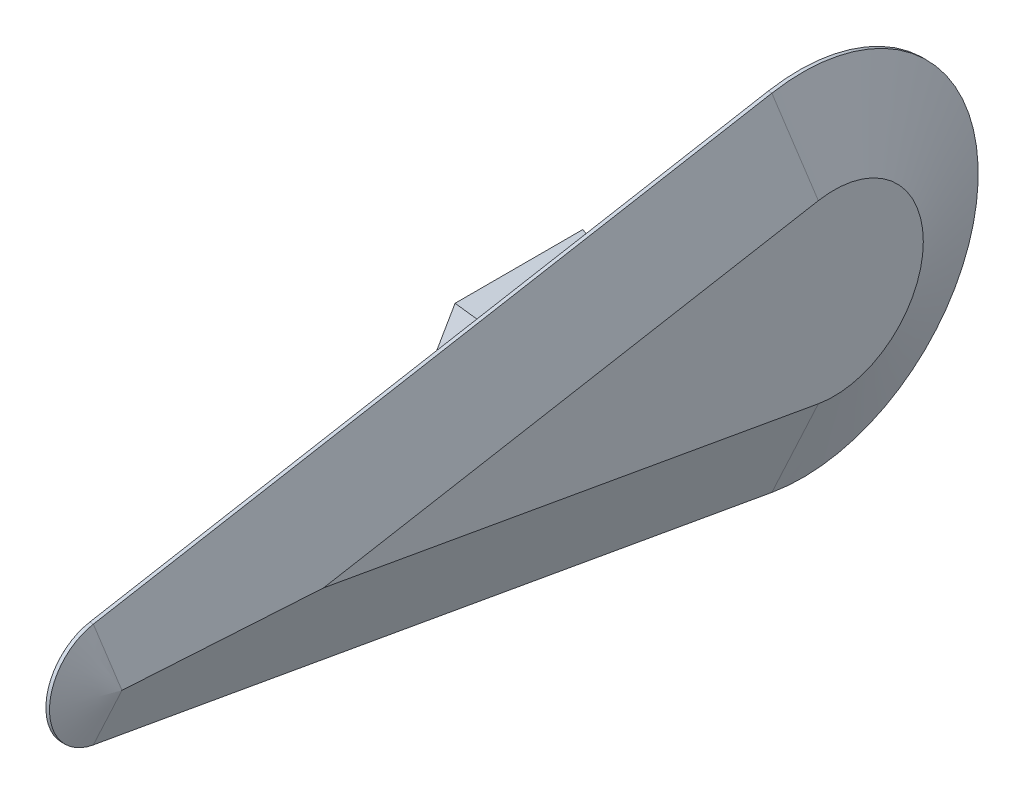
ISO-10303-21;
HEADER;
FILE_DESCRIPTION(('STEP AP214'),'2;1');
FILE_NAME('part.step','',(''),(''),'','','');
FILE_SCHEMA(('AUTOMOTIVE_DESIGN { 1 0 10303 214 1 1 1 1 }'));
ENDSEC;
DATA;
#1=APPLICATION_CONTEXT('core data for automotive mechanical design processes');
#2=APPLICATION_PROTOCOL_DEFINITION('international standard','automotive_design',2000,#1);
#3=PRODUCT_CONTEXT('',#1,'mechanical');
#4=PRODUCT('Part','Part','',(#3));
#5=PRODUCT_RELATED_PRODUCT_CATEGORY('part','',(#4));
#6=PRODUCT_DEFINITION_FORMATION('','',#4);
#7=PRODUCT_DEFINITION_CONTEXT('part definition',#1,'design');
#8=PRODUCT_DEFINITION('design','',#6,#7);
#9=PRODUCT_DEFINITION_SHAPE('','',#8);
#10=(LENGTH_UNIT() NAMED_UNIT(*) SI_UNIT(.MILLI.,.METRE.));
#11=(NAMED_UNIT(*) PLANE_ANGLE_UNIT() SI_UNIT($,.RADIAN.));
#12=(NAMED_UNIT(*) SI_UNIT($,.STERADIAN.) SOLID_ANGLE_UNIT());
#13=UNCERTAINTY_MEASURE_WITH_UNIT(LENGTH_MEASURE(1.E-05),#10,'distance_accuracy_value','');
#14=(GEOMETRIC_REPRESENTATION_CONTEXT(3) GLOBAL_UNCERTAINTY_ASSIGNED_CONTEXT((#13)) GLOBAL_UNIT_ASSIGNED_CONTEXT((#10,
#11,#12)) REPRESENTATION_CONTEXT('',''));
#15=CARTESIAN_POINT('',(0.,0.,0.));
#16=DIRECTION('',(0.,0.,1.));
#17=DIRECTION('',(1.,0.,0.));
#18=AXIS2_PLACEMENT_3D('',#15,#16,#17);
#19=CARTESIAN_POINT('',(0.,0.,0.));
#20=DIRECTION('',(1.,0.,0.));
#21=DIRECTION('',(0.,0.,-1.));
#22=AXIS2_PLACEMENT_3D('',#19,#20,#21);
#23=PLANE('',#22);
#24=CARTESIAN_POINT('',(0.,0.,0.));
#25=DIRECTION('',(1.,0.,0.));
#26=DIRECTION('',(0.,0.,-1.));
#27=AXIS2_PLACEMENT_3D('',#24,#25,#26);
#28=CIRCLE('',#27,15.1809221376421);
#29=CARTESIAN_POINT('',(0.,-14.9466567262577,2.65666137408736));
#30=VERTEX_POINT('',#29);
#31=CARTESIAN_POINT('',(0.,14.9466567262577,2.65666137408737));
#32=VERTEX_POINT('',#31);
#33=EDGE_CURVE('E346',#30,#32,#28,.F.);
#34=ORIENTED_EDGE('',*,*,#33,.T.);
#35=DIRECTION('',(0.,0.175,-0.984568433375761));
#36=VECTOR('',#35,1.);
#37=CARTESIAN_POINT('',(0.,14.9466567262576,2.65666137408736));
#38=LINE('',#37,#36);
#39=CARTESIAN_POINT('',(0.,49.4065518944094,-191.218338625913));
#40=VERTEX_POINT('',#39);
#41=EDGE_CURVE('E352',#32,#40,#38,.T.);
#42=ORIENTED_EDGE('',*,*,#41,.T.);
#43=CARTESIAN_POINT('',(0.,0.,-200.));
#44=DIRECTION('',(1.,0.,0.));
#45=DIRECTION('',(0.,0.,-1.));
#46=AXIS2_PLACEMENT_3D('',#43,#44,#45);
#47=CIRCLE('',#46,50.1809221376421);
#48=CARTESIAN_POINT('',(0.,-49.4065518944093,-191.218338625913));
#49=VERTEX_POINT('',#48);
#50=EDGE_CURVE('E349',#40,#49,#47,.F.);
#51=ORIENTED_EDGE('',*,*,#50,.T.);
#52=DIRECTION('',(0.,0.175,0.984568433375761));
#53=VECTOR('',#52,1.);
#54=CARTESIAN_POINT('',(0.,-14.9466567262577,2.65666137408736));
#55=LINE('',#54,#53);
#56=EDGE_CURVE('E343',#49,#30,#55,.T.);
#57=ORIENTED_EDGE('',*,*,#56,.T.);
#58=EDGE_LOOP('',(#34,#42,#51,#57));
#59=FACE_BOUND('',#58,.T.);
#60=DIRECTION('',(0.,0.866025403784439,-0.5));
#61=VECTOR('',#60,1.);
#62=CARTESIAN_POINT('',(0.,0.,-97.6683849253809));
#63=LINE('',#62,#61);
#64=CARTESIAN_POINT('',(0.,0.,-97.6683849253809));
#65=VERTEX_POINT('',#64);
#66=CARTESIAN_POINT('',(0.,28.,-113.83419246269));
#67=VERTEX_POINT('',#66);
#68=EDGE_CURVE('E196',#65,#67,#63,.T.);
#69=ORIENTED_EDGE('',*,*,#68,.F.);
#70=DIRECTION('',(0.,0.866025403784439,0.5));
#71=VECTOR('',#70,1.);
#72=CARTESIAN_POINT('',(0.,-28.,-113.83419246269));
#73=LINE('',#72,#71);
#74=CARTESIAN_POINT('',(0.,-28.,-113.83419246269));
#75=VERTEX_POINT('',#74);
#76=EDGE_CURVE('E231',#75,#65,#73,.T.);
#77=ORIENTED_EDGE('',*,*,#76,.F.);
#78=DIRECTION('',(0.,0.,1.));
#79=VECTOR('',#78,1.);
#80=CARTESIAN_POINT('',(0.,-28.,-146.16580753731));
#81=LINE('',#80,#79);
#82=CARTESIAN_POINT('',(0.,-28.,-146.16580753731));
#83=VERTEX_POINT('',#82);
#84=EDGE_CURVE('E227',#83,#75,#81,.T.);
#85=ORIENTED_EDGE('',*,*,#84,.F.);
#86=DIRECTION('',(0.,-0.866025403784438,0.500000000000001));
#87=VECTOR('',#86,1.);
#88=CARTESIAN_POINT('',(0.,0.,-162.331615074619));
#89=LINE('',#88,#87);
#90=CARTESIAN_POINT('',(0.,0.,-162.331615074619));
#91=VERTEX_POINT('',#90);
#92=EDGE_CURVE('E223',#91,#83,#89,.T.);
#93=ORIENTED_EDGE('',*,*,#92,.F.);
#94=DIRECTION('',(0.,-0.866025403784438,-0.5));
#95=VECTOR('',#94,1.);
#96=CARTESIAN_POINT('',(0.,28.,-146.16580753731));
#97=LINE('',#96,#95);
#98=CARTESIAN_POINT('',(0.,28.,-146.16580753731));
#99=VERTEX_POINT('',#98);
#100=EDGE_CURVE('E71',#99,#91,#97,.T.);
#101=ORIENTED_EDGE('',*,*,#100,.F.);
#102=DIRECTION('',(0.,0.,-1.));
#103=VECTOR('',#102,1.);
#104=CARTESIAN_POINT('',(0.,28.,-113.83419246269));
#105=LINE('',#104,#103);
#106=EDGE_CURVE('E66',#67,#99,#105,.T.);
#107=ORIENTED_EDGE('',*,*,#106,.F.);
#108=EDGE_LOOP('',(#69,#77,#85,#93,#101,#107));
#109=FACE_BOUND('',#108,.T.);
#110=ADVANCED_FACE('F47',(#59,#109),#23,.F.);
#111=CARTESIAN_POINT('',(0.,17.7222318007637,3.15));
#112=DIRECTION('',(0.939692620785909,0.336742236697104,0.0598535250819916));
#113=DIRECTION('',(-0.337347042376119,0.941380355116934,0.));
#114=AXIS2_PLACEMENT_3D('',#111,#112,#113);
#115=PLANE('',#114);
#116=DIRECTION('',(-0.342020143325666,0.925191691501946,0.164446208637534));
#117=VECTOR('',#116,1.);
#118=CARTESIAN_POINT('',(0.,52.1821269689153,-190.725));
#119=LINE('',#118,#117);
#120=CARTESIAN_POINT('',(10.,25.1313315828379,-195.533085484046));
#121=VERTEX_POINT('',#120);
#122=CARTESIAN_POINT('',(1.02606042997705,49.4065518944093,-191.218338625913));
#123=VERTEX_POINT('',#122);
#124=EDGE_CURVE('E319',#121,#123,#119,.T.);
#125=ORIENTED_EDGE('',*,*,#124,.T.);
#126=DIRECTION('',(0.,0.175,-0.984568433375761));
#127=VECTOR('',#126,1.);
#128=CARTESIAN_POINT('',(1.02606042997705,14.9466567262577,2.65666137408737));
#129=LINE('',#128,#127);
#130=CARTESIAN_POINT('',(1.02606042997705,14.9466567262577,2.65666137408737));
#131=VERTEX_POINT('',#130);
#132=EDGE_CURVE('E314',#123,#131,#129,.F.);
#133=ORIENTED_EDGE('',*,*,#132,.T.);
#134=DIRECTION('',(-0.342020143325666,0.925191691501946,0.164446208637534));
#135=VECTOR('',#134,1.);
#136=CARTESIAN_POINT('',(0.,17.7222318007637,3.15));
#137=LINE('',#136,#135);
#138=CARTESIAN_POINT('',(6.55146421679159,0.,0.));
#139=VERTEX_POINT('',#138);
#140=EDGE_CURVE('E310',#139,#131,#137,.T.);
#141=ORIENTED_EDGE('',*,*,#140,.F.);
#142=DIRECTION('',(0.0635659770910905,0.,-0.997977638304814));
#143=VECTOR('',#142,1.);
#144=CARTESIAN_POINT('',(6.32516426673723,0.,3.55288001598889));
#145=LINE('',#144,#143);
#146=CARTESIAN_POINT('',(10.,0.,-54.1415668259798));
#147=VERTEX_POINT('',#146);
#148=EDGE_CURVE('E315',#147,#139,#145,.F.);
#149=ORIENTED_EDGE('',*,*,#148,.F.);
#150=DIRECTION('',(0.,0.175,-0.984568433375761));
#151=VECTOR('',#150,1.);
#152=CARTESIAN_POINT('',(10.,-9.32856358531371,-1.65808548404563));
#153=LINE('',#152,#151);
#154=EDGE_CURVE('E331',#121,#147,#153,.F.);
#155=ORIENTED_EDGE('',*,*,#154,.F.);
#156=EDGE_LOOP('',(#125,#133,#141,#149,#155));
#157=FACE_BOUND('',#156,.T.);
#158=ADVANCED_FACE('F394',(#157),#115,.T.);
#159=CARTESIAN_POINT('',(0.,0.,0.));
#160=DIRECTION('',(-1.,0.,0.));
#161=DIRECTION('',(0.,0.,-1.));
#162=AXIS2_PLACEMENT_3D('',#159,#160,#161);
#163=CONICAL_SURFACE('',#162,18.,1.22173047639603);
#164=ORIENTED_EDGE('',*,*,#140,.T.);
#165=CARTESIAN_POINT('',(1.02606042997705,0.,0.));
#166=DIRECTION('',(1.,0.,0.));
#167=DIRECTION('',(0.,0.,-1.));
#168=AXIS2_PLACEMENT_3D('',#165,#166,#167);
#169=CIRCLE('',#168,15.1809221376421);
#170=CARTESIAN_POINT('',(1.02606042997705,-14.9466567262577,2.65666137408737));
#171=VERTEX_POINT('',#170);
#172=EDGE_CURVE('E58',#131,#171,#169,.T.);
#173=ORIENTED_EDGE('',*,*,#172,.T.);
#174=DIRECTION('',(-0.342020143325666,-0.925191691501946,0.164446208637534));
#175=VECTOR('',#174,1.);
#176=CARTESIAN_POINT('',(0.,-17.7222318007637,3.15));
#177=LINE('',#176,#175);
#178=EDGE_CURVE('E318',#139,#171,#177,.T.);
#179=ORIENTED_EDGE('',*,*,#178,.F.);
#180=EDGE_LOOP('',(#164,#173,#179));
#181=FACE_BOUND('',#180,.T.);
#182=ADVANCED_FACE('F398',(#181),#163,.T.);
#183=CARTESIAN_POINT('',(0.,-17.7222318007637,3.15));
#184=DIRECTION('',(0.939692620785909,-0.336742236697104,0.0598535250819916));
#185=DIRECTION('',(0.337347042376119,0.941380355116934,0.));
#186=AXIS2_PLACEMENT_3D('',#183,#184,#185);
#187=PLANE('',#186);
#188=ORIENTED_EDGE('',*,*,#178,.T.);
#189=DIRECTION('',(0.,-0.175,-0.984568433375761));
#190=VECTOR('',#189,1.);
#191=CARTESIAN_POINT('',(1.02606042997705,-49.4065518944094,-191.218338625913));
#192=LINE('',#191,#190);
#193=CARTESIAN_POINT('',(1.02606042997705,-49.4065518944094,-191.218338625913));
#194=VERTEX_POINT('',#193);
#195=EDGE_CURVE('E11',#171,#194,#192,.T.);
#196=ORIENTED_EDGE('',*,*,#195,.T.);
#197=DIRECTION('',(-0.342020143325666,-0.925191691501946,0.164446208637534));
#198=VECTOR('',#197,1.);
#199=CARTESIAN_POINT('',(0.,-52.1821269689153,-190.725));
#200=LINE('',#199,#198);
#201=CARTESIAN_POINT('',(10.,-25.1313315828379,-195.533085484046));
#202=VERTEX_POINT('',#201);
#203=EDGE_CURVE('E323',#202,#194,#200,.T.);
#204=ORIENTED_EDGE('',*,*,#203,.F.);
#205=DIRECTION('',(0.,0.175,0.984568433375761));
#206=VECTOR('',#205,1.);
#207=CARTESIAN_POINT('',(10.,9.32856358531369,-1.65808548404563));
#208=LINE('',#207,#206);
#209=EDGE_CURVE('E335',#202,#147,#208,.T.);
#210=ORIENTED_EDGE('',*,*,#209,.T.);
#211=ORIENTED_EDGE('',*,*,#148,.T.);
#212=EDGE_LOOP('',(#188,#196,#204,#210,#211));
#213=FACE_BOUND('',#212,.T.);
#214=ADVANCED_FACE('F400',(#213),#187,.T.);
#215=CARTESIAN_POINT('',(0.,0.,-200.));
#216=DIRECTION('',(-1.,0.,0.));
#217=DIRECTION('',(0.,0.,-1.));
#218=AXIS2_PLACEMENT_3D('',#215,#216,#217);
#219=CONICAL_SURFACE('',#218,53.,1.22173047639603);
#220=ORIENTED_EDGE('',*,*,#203,.T.);
#221=CARTESIAN_POINT('',(1.02606042997705,0.,-200.));
#222=DIRECTION('',(1.,0.,0.));
#223=DIRECTION('',(0.,0.,-1.));
#224=AXIS2_PLACEMENT_3D('',#221,#222,#223);
#225=CIRCLE('',#224,50.1809221376421);
#226=EDGE_CURVE('E356',#194,#123,#225,.T.);
#227=ORIENTED_EDGE('',*,*,#226,.T.);
#228=ORIENTED_EDGE('',*,*,#124,.F.);
#229=CARTESIAN_POINT('',(10.,0.,-200.));
#230=DIRECTION('',(1.,0.,0.));
#231=DIRECTION('',(0.,0.,-1.));
#232=AXIS2_PLACEMENT_3D('',#229,#230,#231);
#233=CIRCLE('',#232,25.5252258054535);
#234=EDGE_CURVE('E324',#202,#121,#233,.T.);
#235=ORIENTED_EDGE('',*,*,#234,.F.);
#236=EDGE_LOOP('',(#220,#227,#228,#235));
#237=FACE_BOUND('',#236,.T.);
#238=ADVANCED_FACE('F406',(#237),#219,.T.);
#239=CARTESIAN_POINT('',(10.,0.,0.));
#240=DIRECTION('',(1.,0.,0.));
#241=DIRECTION('',(0.,0.,-1.));
#242=AXIS2_PLACEMENT_3D('',#239,#240,#241);
#243=PLANE('',#242);
#244=ORIENTED_EDGE('',*,*,#154,.T.);
#245=ORIENTED_EDGE('',*,*,#209,.F.);
#246=ORIENTED_EDGE('',*,*,#234,.T.);
#247=EDGE_LOOP('',(#244,#245,#246));
#248=FACE_BOUND('',#247,.T.);
#249=ADVANCED_FACE('F403',(#248),#243,.T.);
#250=CARTESIAN_POINT('',(0.,-14.9466567262577,2.65666137408736));
#251=DIRECTION('',(0.,-0.984568433375761,0.175));
#252=DIRECTION('',(0.,-0.175,-0.984568433375761));
#253=AXIS2_PLACEMENT_3D('',#250,#251,#252);
#254=PLANE('',#253);
#255=DIRECTION('',(1.,0.,0.));
#256=VECTOR('',#255,1.);
#257=CARTESIAN_POINT('',(0.,-14.9466567262577,2.65666137408736));
#258=LINE('',#257,#256);
#259=EDGE_CURVE('E365',#30,#171,#258,.T.);
#260=ORIENTED_EDGE('',*,*,#259,.F.);
#261=ORIENTED_EDGE('',*,*,#56,.F.);
#262=DIRECTION('',(-1.,0.,0.));
#263=VECTOR('',#262,1.);
#264=CARTESIAN_POINT('',(1.02606042997705,-49.4065518944094,-191.218338625913));
#265=LINE('',#264,#263);
#266=EDGE_CURVE('E52',#194,#49,#265,.T.);
#267=ORIENTED_EDGE('',*,*,#266,.F.);
#268=ORIENTED_EDGE('',*,*,#195,.F.);
#269=EDGE_LOOP('',(#260,#261,#267,#268));
#270=FACE_BOUND('',#269,.T.);
#271=ADVANCED_FACE('F50',(#270),#254,.T.);
#272=CARTESIAN_POINT('',(1.02606042997705,0.,-200.));
#273=DIRECTION('',(1.,0.,0.));
#274=DIRECTION('',(0.,0.,-1.));
#275=AXIS2_PLACEMENT_3D('',#272,#273,#274);
#276=CYLINDRICAL_SURFACE('',#275,50.1809221376421);
#277=ORIENTED_EDGE('',*,*,#266,.T.);
#278=ORIENTED_EDGE('',*,*,#50,.F.);
#279=DIRECTION('',(-1.,0.,0.));
#280=VECTOR('',#279,1.);
#281=CARTESIAN_POINT('',(1.02606042997704,49.4065518944094,-191.218338625913));
#282=LINE('',#281,#280);
#283=EDGE_CURVE('E363',#123,#40,#282,.T.);
#284=ORIENTED_EDGE('',*,*,#283,.F.);
#285=ORIENTED_EDGE('',*,*,#226,.F.);
#286=EDGE_LOOP('',(#277,#278,#284,#285));
#287=FACE_BOUND('',#286,.T.);
#288=ADVANCED_FACE('F378',(#287),#276,.T.);
#289=CARTESIAN_POINT('',(1.02606042997705,0.,0.));
#290=DIRECTION('',(1.,0.,0.));
#291=DIRECTION('',(0.,0.,-1.));
#292=AXIS2_PLACEMENT_3D('',#289,#290,#291);
#293=CYLINDRICAL_SURFACE('',#292,15.1809221376421);
#294=ORIENTED_EDGE('',*,*,#259,.T.);
#295=ORIENTED_EDGE('',*,*,#172,.F.);
#296=DIRECTION('',(1.,0.,0.));
#297=VECTOR('',#296,1.);
#298=CARTESIAN_POINT('',(0.,14.9466567262577,2.65666137408737));
#299=LINE('',#298,#297);
#300=EDGE_CURVE('E239',#32,#131,#299,.T.);
#301=ORIENTED_EDGE('',*,*,#300,.F.);
#302=ORIENTED_EDGE('',*,*,#33,.F.);
#303=EDGE_LOOP('',(#294,#295,#301,#302));
#304=FACE_BOUND('',#303,.T.);
#305=ADVANCED_FACE('F389',(#304),#293,.T.);
#306=CARTESIAN_POINT('',(1.02606042997705,14.9466567262577,2.65666137408737));
#307=DIRECTION('',(0.,0.984568433375761,0.175));
#308=DIRECTION('',(0.,0.175,-0.984568433375761));
#309=AXIS2_PLACEMENT_3D('',#306,#307,#308);
#310=PLANE('',#309);
#311=ORIENTED_EDGE('',*,*,#283,.T.);
#312=ORIENTED_EDGE('',*,*,#41,.F.);
#313=ORIENTED_EDGE('',*,*,#300,.T.);
#314=ORIENTED_EDGE('',*,*,#132,.F.);
#315=EDGE_LOOP('',(#311,#312,#313,#314));
#316=FACE_BOUND('',#315,.T.);
#317=ADVANCED_FACE('F387',(#316),#310,.T.);
#318=CARTESIAN_POINT('',(-10.,0.,0.));
#319=DIRECTION('',(-1.,0.,0.));
#320=DIRECTION('',(0.,0.,1.));
#321=AXIS2_PLACEMENT_3D('',#318,#319,#320);
#322=PLANE('',#321);
#323=DIRECTION('',(0.,-0.866025403784439,0.5));
#324=VECTOR('',#323,1.);
#325=CARTESIAN_POINT('',(-10.,1.81985117133099,-94.5163102344219));
#326=LINE('',#325,#324);
#327=CARTESIAN_POINT('',(-10.,0.,-93.4656186707689));
#328=VERTEX_POINT('',#327);
#329=CARTESIAN_POINT('',(-10.,31.639702342662,-111.732809335384));
#330=VERTEX_POINT('',#329);
#331=EDGE_CURVE('E235',#328,#330,#326,.F.);
#332=ORIENTED_EDGE('',*,*,#331,.T.);
#333=DIRECTION('',(0.,0.,1.));
#334=VECTOR('',#333,1.);
#335=CARTESIAN_POINT('',(-10.,31.639702342662,-113.83419246269));
#336=LINE('',#335,#334);
#337=CARTESIAN_POINT('',(-10.,31.639702342662,-148.267190664616));
#338=VERTEX_POINT('',#337);
#339=EDGE_CURVE('E264',#330,#338,#336,.F.);
#340=ORIENTED_EDGE('',*,*,#339,.T.);
#341=DIRECTION('',(0.,0.866025403784438,0.5));
#342=VECTOR('',#341,1.);
#343=CARTESIAN_POINT('',(-10.,29.819851171331,-149.317882228269));
#344=LINE('',#343,#342);
#345=CARTESIAN_POINT('',(-10.,0.,-166.534381329231));
#346=VERTEX_POINT('',#345);
#347=EDGE_CURVE('E267',#338,#346,#344,.F.);
#348=ORIENTED_EDGE('',*,*,#347,.T.);
#349=DIRECTION('',(0.,0.866025403784438,-0.500000000000001));
#350=VECTOR('',#349,1.);
#351=CARTESIAN_POINT('',(-10.,-1.819851171331,-165.483689765578));
#352=LINE('',#351,#350);
#353=CARTESIAN_POINT('',(-10.,-31.639702342662,-148.267190664616));
#354=VERTEX_POINT('',#353);
#355=EDGE_CURVE('E270',#346,#354,#352,.F.);
#356=ORIENTED_EDGE('',*,*,#355,.T.);
#357=DIRECTION('',(0.,0.,-1.));
#358=VECTOR('',#357,1.);
#359=CARTESIAN_POINT('',(-10.,-31.639702342662,-146.16580753731));
#360=LINE('',#359,#358);
#361=CARTESIAN_POINT('',(-10.,-31.639702342662,-111.732809335384));
#362=VERTEX_POINT('',#361);
#363=EDGE_CURVE('E273',#354,#362,#360,.F.);
#364=ORIENTED_EDGE('',*,*,#363,.T.);
#365=DIRECTION('',(0.,-0.866025403784439,-0.5));
#366=VECTOR('',#365,1.);
#367=CARTESIAN_POINT('',(-10.,-29.819851171331,-110.682117771731));
#368=LINE('',#367,#366);
#369=EDGE_CURVE('E246',#362,#328,#368,.F.);
#370=ORIENTED_EDGE('',*,*,#369,.T.);
#371=EDGE_LOOP('',(#332,#340,#348,#356,#364,#370));
#372=FACE_BOUND('',#371,.T.);
#373=DIRECTION('',(0.,-0.866025403784438,0.500000000000001));
#374=VECTOR('',#373,1.);
#375=CARTESIAN_POINT('',(-10.,1.81985117133104,-155.715438768522));
#376=LINE('',#375,#374);
#377=CARTESIAN_POINT('',(-10.,0.,-154.664747204869));
#378=VERTEX_POINT('',#377);
#379=CARTESIAN_POINT('',(-10.,-21.360297657338,-142.332373602435));
#380=VERTEX_POINT('',#379);
#381=EDGE_CURVE('E295',#378,#380,#376,.T.);
#382=ORIENTED_EDGE('',*,*,#381,.F.);
#383=DIRECTION('',(0.,-0.866025403784438,-0.5));
#384=VECTOR('',#383,1.);
#385=CARTESIAN_POINT('',(-10.,23.180148828669,-141.281682038782));
#386=LINE('',#385,#384);
#387=CARTESIAN_POINT('',(-10.,21.360297657338,-142.332373602435));
#388=VERTEX_POINT('',#387);
#389=EDGE_CURVE('E194',#388,#378,#386,.T.);
#390=ORIENTED_EDGE('',*,*,#389,.F.);
#391=DIRECTION('',(0.,0.,-1.));
#392=VECTOR('',#391,1.);
#393=CARTESIAN_POINT('',(-10.,21.360297657338,-115.566243270259));
#394=LINE('',#393,#392);
#395=CARTESIAN_POINT('',(-10.,21.360297657338,-117.667626397565));
#396=VERTEX_POINT('',#395);
#397=EDGE_CURVE('E281',#396,#388,#394,.T.);
#398=ORIENTED_EDGE('',*,*,#397,.F.);
#399=DIRECTION('',(0.,0.866025403784438,-0.5));
#400=VECTOR('',#399,1.);
#401=CARTESIAN_POINT('',(-10.,-1.81985117133104,-104.284561231478));
#402=LINE('',#401,#400);
#403=CARTESIAN_POINT('',(-10.,0.,-105.335252795131));
#404=VERTEX_POINT('',#403);
#405=EDGE_CURVE('E298',#404,#396,#402,.T.);
#406=ORIENTED_EDGE('',*,*,#405,.F.);
#407=DIRECTION('',(0.,0.866025403784439,0.5));
#408=VECTOR('',#407,1.);
#409=CARTESIAN_POINT('',(-10.,-23.180148828669,-118.718317961218));
#410=LINE('',#409,#408);
#411=CARTESIAN_POINT('',(-10.,-21.360297657338,-117.667626397565));
#412=VERTEX_POINT('',#411);
#413=EDGE_CURVE('E302',#412,#404,#410,.T.);
#414=ORIENTED_EDGE('',*,*,#413,.F.);
#415=DIRECTION('',(0.,0.,1.));
#416=VECTOR('',#415,1.);
#417=CARTESIAN_POINT('',(-10.,-21.360297657338,-144.433756729741));
#418=LINE('',#417,#416);
#419=EDGE_CURVE('E305',#380,#412,#418,.T.);
#420=ORIENTED_EDGE('',*,*,#419,.F.);
#421=EDGE_LOOP('',(#382,#390,#398,#406,#414,#420));
#422=FACE_BOUND('',#421,.T.);
#423=ADVANCED_FACE('F473',(#372,#422),#322,.T.);
#424=CARTESIAN_POINT('',(0.,0.,-97.6683849253809));
#425=DIRECTION('',(0.342020143325669,0.469846310392954,0.813797681349373));
#426=DIRECTION('',(0.,-0.866025403784439,0.5));
#427=AXIS2_PLACEMENT_3D('',#424,#425,#426);
#428=PLANE('',#427);
#429=ORIENTED_EDGE('',*,*,#68,.T.);
#430=DIRECTION('',(0.921891033043757,-0.335540895264848,-0.193724626205288));
#431=VECTOR('',#430,1.);
#432=CARTESIAN_POINT('',(0.,28.,-113.83419246269));
#433=LINE('',#432,#431);
#434=EDGE_CURVE('E236',#330,#67,#433,.T.);
#435=ORIENTED_EDGE('',*,*,#434,.F.);
#436=ORIENTED_EDGE('',*,*,#331,.F.);
#437=DIRECTION('',(0.921891033043757,0.,-0.387449252410576));
#438=VECTOR('',#437,1.);
#439=CARTESIAN_POINT('',(0.,0.,-97.6683849253809));
#440=LINE('',#439,#438);
#441=EDGE_CURVE('E241',#328,#65,#440,.T.);
#442=ORIENTED_EDGE('',*,*,#441,.T.);
#443=EDGE_LOOP('',(#429,#435,#436,#442));
#444=FACE_BOUND('',#443,.T.);
#445=ADVANCED_FACE('F455',(#444),#428,.T.);
#446=CARTESIAN_POINT('',(0.,28.,-113.83419246269));
#447=DIRECTION('',(0.342020143325669,0.939692620785908,0.));
#448=DIRECTION('',(-0.939692620785908,0.342020143325669,0.));
#449=AXIS2_PLACEMENT_3D('',#446,#447,#448);
#450=PLANE('',#449);
#451=ORIENTED_EDGE('',*,*,#106,.T.);
#452=DIRECTION('',(0.921891033043757,-0.335540895264848,0.193724626205288));
#453=VECTOR('',#452,1.);
#454=CARTESIAN_POINT('',(0.,28.,-146.16580753731));
#455=LINE('',#454,#453);
#456=EDGE_CURVE('E240',#338,#99,#455,.T.);
#457=ORIENTED_EDGE('',*,*,#456,.F.);
#458=ORIENTED_EDGE('',*,*,#339,.F.);
#459=ORIENTED_EDGE('',*,*,#434,.T.);
#460=EDGE_LOOP('',(#451,#457,#458,#459));
#461=FACE_BOUND('',#460,.T.);
#462=ADVANCED_FACE('F451',(#461),#450,.T.);
#463=CARTESIAN_POINT('',(0.,28.,-146.16580753731));
#464=DIRECTION('',(0.342020143325669,0.469846310392954,-0.813797681349373));
#465=DIRECTION('',(0.,0.866025403784438,0.5));
#466=AXIS2_PLACEMENT_3D('',#463,#464,#465);
#467=PLANE('',#466);
#468=ORIENTED_EDGE('',*,*,#100,.T.);
#469=DIRECTION('',(0.921891033043757,0.,0.387449252410577));
#470=VECTOR('',#469,1.);
#471=CARTESIAN_POINT('',(0.,0.,-162.331615074619));
#472=LINE('',#471,#470);
#473=EDGE_CURVE('E254',#346,#91,#472,.T.);
#474=ORIENTED_EDGE('',*,*,#473,.F.);
#475=ORIENTED_EDGE('',*,*,#347,.F.);
#476=ORIENTED_EDGE('',*,*,#456,.T.);
#477=EDGE_LOOP('',(#468,#474,#475,#476));
#478=FACE_BOUND('',#477,.T.);
#479=ADVANCED_FACE('F454',(#478),#467,.T.);
#480=CARTESIAN_POINT('',(0.,0.,-162.331615074619));
#481=DIRECTION('',(0.342020143325669,-0.469846310392955,-0.813797681349373));
#482=DIRECTION('',(0.,0.866025403784438,-0.500000000000001));
#483=AXIS2_PLACEMENT_3D('',#480,#481,#482);
#484=PLANE('',#483);
#485=ORIENTED_EDGE('',*,*,#92,.T.);
#486=DIRECTION('',(0.921891033043757,0.335540895264848,0.193724626205288));
#487=VECTOR('',#486,1.);
#488=CARTESIAN_POINT('',(0.,-28.,-146.16580753731));
#489=LINE('',#488,#487);
#490=EDGE_CURVE('E250',#354,#83,#489,.T.);
#491=ORIENTED_EDGE('',*,*,#490,.F.);
#492=ORIENTED_EDGE('',*,*,#355,.F.);
#493=ORIENTED_EDGE('',*,*,#473,.T.);
#494=EDGE_LOOP('',(#485,#491,#492,#493));
#495=FACE_BOUND('',#494,.T.);
#496=ADVANCED_FACE('F459',(#495),#484,.T.);
#497=CARTESIAN_POINT('',(0.,-28.,-146.16580753731));
#498=DIRECTION('',(0.342020143325669,-0.939692620785908,0.));
#499=DIRECTION('',(0.939692620785908,0.342020143325669,0.));
#500=AXIS2_PLACEMENT_3D('',#497,#498,#499);
#501=PLANE('',#500);
#502=ORIENTED_EDGE('',*,*,#84,.T.);
#503=DIRECTION('',(0.921891033043757,0.335540895264848,-0.193724626205288));
#504=VECTOR('',#503,1.);
#505=CARTESIAN_POINT('',(0.,-28.,-113.83419246269));
#506=LINE('',#505,#504);
#507=EDGE_CURVE('E245',#362,#75,#506,.T.);
#508=ORIENTED_EDGE('',*,*,#507,.F.);
#509=ORIENTED_EDGE('',*,*,#363,.F.);
#510=ORIENTED_EDGE('',*,*,#490,.T.);
#511=EDGE_LOOP('',(#502,#508,#509,#510));
#512=FACE_BOUND('',#511,.T.);
#513=ADVANCED_FACE('F463',(#512),#501,.T.);
#514=CARTESIAN_POINT('',(0.,-28.,-113.83419246269));
#515=DIRECTION('',(0.342020143325669,-0.469846310392954,0.813797681349373));
#516=DIRECTION('',(0.,-0.866025403784439,-0.5));
#517=AXIS2_PLACEMENT_3D('',#514,#515,#516);
#518=PLANE('',#517);
#519=ORIENTED_EDGE('',*,*,#76,.T.);
#520=ORIENTED_EDGE('',*,*,#441,.F.);
#521=ORIENTED_EDGE('',*,*,#369,.F.);
#522=ORIENTED_EDGE('',*,*,#507,.T.);
#523=EDGE_LOOP('',(#519,#520,#521,#522));
#524=FACE_BOUND('',#523,.T.);
#525=ADVANCED_FACE('F450',(#524),#518,.T.);
#526=CARTESIAN_POINT('',(0.,25.,-144.433756729741));
#527=DIRECTION('',(0.342020143325669,-0.469846310392954,0.813797681349373));
#528=DIRECTION('',(0.,-0.866025403784438,-0.5));
#529=AXIS2_PLACEMENT_3D('',#526,#527,#528);
#530=PLANE('',#529);
#531=DIRECTION('',(0.,-0.866025403784438,-0.5));
#532=VECTOR('',#531,1.);
#533=CARTESIAN_POINT('',(0.,25.,-144.433756729741));
#534=LINE('',#533,#532);
#535=CARTESIAN_POINT('',(0.,25.,-144.433756729741));
#536=VERTEX_POINT('',#535);
#537=CARTESIAN_POINT('',(0.,0.,-158.867513459481));
#538=VERTEX_POINT('',#537);
#539=EDGE_CURVE('E186',#536,#538,#534,.T.);
#540=ORIENTED_EDGE('',*,*,#539,.F.);
#541=DIRECTION('',(0.921891033043757,0.335540895264848,-0.193724626205288));
#542=VECTOR('',#541,1.);
#543=CARTESIAN_POINT('',(0.,25.,-144.433756729741));
#544=LINE('',#543,#542);
#545=EDGE_CURVE('E278',#388,#536,#544,.T.);
#546=ORIENTED_EDGE('',*,*,#545,.F.);
#547=ORIENTED_EDGE('',*,*,#389,.T.);
#548=DIRECTION('',(0.921891033043757,0.,-0.387449252410577));
#549=VECTOR('',#548,1.);
#550=CARTESIAN_POINT('',(0.,0.,-158.867513459481));
#551=LINE('',#550,#549);
#552=EDGE_CURVE('E176',#378,#538,#551,.T.);
#553=ORIENTED_EDGE('',*,*,#552,.T.);
#554=EDGE_LOOP('',(#540,#546,#547,#553));
#555=FACE_BOUND('',#554,.T.);
#556=ADVANCED_FACE('F190',(#555),#530,.T.);
#557=CARTESIAN_POINT('',(0.,0.,-158.867513459481));
#558=DIRECTION('',(0.342020143325669,0.469846310392955,0.813797681349373));
#559=DIRECTION('',(0.,-0.866025403784438,0.500000000000001));
#560=AXIS2_PLACEMENT_3D('',#557,#558,#559);
#561=PLANE('',#560);
#562=DIRECTION('',(0.,-0.866025403784438,0.500000000000001));
#563=VECTOR('',#562,1.);
#564=CARTESIAN_POINT('',(0.,0.,-158.867513459481));
#565=LINE('',#564,#563);
#566=CARTESIAN_POINT('',(0.,-25.,-144.433756729741));
#567=VERTEX_POINT('',#566);
#568=EDGE_CURVE('E173',#538,#567,#565,.T.);
#569=ORIENTED_EDGE('',*,*,#568,.F.);
#570=ORIENTED_EDGE('',*,*,#552,.F.);
#571=ORIENTED_EDGE('',*,*,#381,.T.);
#572=DIRECTION('',(0.921891033043757,-0.335540895264848,-0.193724626205288));
#573=VECTOR('',#572,1.);
#574=CARTESIAN_POINT('',(0.,-25.,-144.433756729741));
#575=LINE('',#574,#573);
#576=EDGE_CURVE('E179',#380,#567,#575,.T.);
#577=ORIENTED_EDGE('',*,*,#576,.T.);
#578=EDGE_LOOP('',(#569,#570,#571,#577));
#579=FACE_BOUND('',#578,.T.);
#580=ADVANCED_FACE('F175',(#579),#561,.T.);
#581=CARTESIAN_POINT('',(0.,-25.,-144.433756729741));
#582=DIRECTION('',(0.342020143325669,0.939692620785908,0.));
#583=DIRECTION('',(-0.939692620785908,0.342020143325669,0.));
#584=AXIS2_PLACEMENT_3D('',#581,#582,#583);
#585=PLANE('',#584);
#586=DIRECTION('',(0.,0.,1.));
#587=VECTOR('',#586,1.);
#588=CARTESIAN_POINT('',(0.,-25.,-144.433756729741));
#589=LINE('',#588,#587);
#590=CARTESIAN_POINT('',(0.,-25.,-115.566243270259));
#591=VERTEX_POINT('',#590);
#592=EDGE_CURVE('E185',#567,#591,#589,.T.);
#593=ORIENTED_EDGE('',*,*,#592,.F.);
#594=ORIENTED_EDGE('',*,*,#576,.F.);
#595=ORIENTED_EDGE('',*,*,#419,.T.);
#596=DIRECTION('',(0.921891033043757,-0.335540895264848,0.193724626205288));
#597=VECTOR('',#596,1.);
#598=CARTESIAN_POINT('',(0.,-25.,-115.566243270259));
#599=LINE('',#598,#597);
#600=EDGE_CURVE('E285',#412,#591,#599,.T.);
#601=ORIENTED_EDGE('',*,*,#600,.T.);
#602=EDGE_LOOP('',(#593,#594,#595,#601));
#603=FACE_BOUND('',#602,.T.);
#604=ADVANCED_FACE('F441',(#603),#585,.T.);
#605=CARTESIAN_POINT('',(0.,-25.,-115.566243270259));
#606=DIRECTION('',(0.342020143325669,0.469846310392954,-0.813797681349373));
#607=DIRECTION('',(0.,0.866025403784439,0.5));
#608=AXIS2_PLACEMENT_3D('',#605,#606,#607);
#609=PLANE('',#608);
#610=DIRECTION('',(0.,0.866025403784439,0.5));
#611=VECTOR('',#610,1.);
#612=CARTESIAN_POINT('',(0.,-25.,-115.566243270259));
#613=LINE('',#612,#611);
#614=CARTESIAN_POINT('',(0.,0.,-101.132486540519));
#615=VERTEX_POINT('',#614);
#616=EDGE_CURVE('E207',#591,#615,#613,.T.);
#617=ORIENTED_EDGE('',*,*,#616,.F.);
#618=ORIENTED_EDGE('',*,*,#600,.F.);
#619=ORIENTED_EDGE('',*,*,#413,.T.);
#620=DIRECTION('',(0.921891033043757,0.,0.387449252410576));
#621=VECTOR('',#620,1.);
#622=CARTESIAN_POINT('',(0.,0.,-101.132486540519));
#623=LINE('',#622,#621);
#624=EDGE_CURVE('E288',#404,#615,#623,.T.);
#625=ORIENTED_EDGE('',*,*,#624,.T.);
#626=EDGE_LOOP('',(#617,#618,#619,#625));
#627=FACE_BOUND('',#626,.T.);
#628=ADVANCED_FACE('F435',(#627),#609,.T.);
#629=CARTESIAN_POINT('',(0.,0.,-101.132486540519));
#630=DIRECTION('',(0.342020143325669,-0.469846310392954,-0.813797681349373));
#631=DIRECTION('',(0.,0.866025403784438,-0.5));
#632=AXIS2_PLACEMENT_3D('',#629,#630,#631);
#633=PLANE('',#632);
#634=DIRECTION('',(0.,0.866025403784438,-0.5));
#635=VECTOR('',#634,1.);
#636=CARTESIAN_POINT('',(0.,0.,-101.132486540519));
#637=LINE('',#636,#635);
#638=CARTESIAN_POINT('',(0.,25.,-115.566243270259));
#639=VERTEX_POINT('',#638);
#640=EDGE_CURVE('E211',#615,#639,#637,.T.);
#641=ORIENTED_EDGE('',*,*,#640,.F.);
#642=ORIENTED_EDGE('',*,*,#624,.F.);
#643=ORIENTED_EDGE('',*,*,#405,.T.);
#644=DIRECTION('',(0.921891033043757,0.335540895264848,0.193724626205288));
#645=VECTOR('',#644,1.);
#646=CARTESIAN_POINT('',(0.,25.,-115.566243270259));
#647=LINE('',#646,#645);
#648=EDGE_CURVE('E280',#396,#639,#647,.T.);
#649=ORIENTED_EDGE('',*,*,#648,.T.);
#650=EDGE_LOOP('',(#641,#642,#643,#649));
#651=FACE_BOUND('',#650,.T.);
#652=ADVANCED_FACE('F429',(#651),#633,.T.);
#653=CARTESIAN_POINT('',(0.,25.,-115.566243270259));
#654=DIRECTION('',(0.342020143325669,-0.939692620785908,0.));
#655=DIRECTION('',(0.939692620785908,0.342020143325669,0.));
#656=AXIS2_PLACEMENT_3D('',#653,#654,#655);
#657=PLANE('',#656);
#658=DIRECTION('',(0.,0.,-1.));
#659=VECTOR('',#658,1.);
#660=CARTESIAN_POINT('',(0.,25.,-115.566243270259));
#661=LINE('',#660,#659);
#662=EDGE_CURVE('E201',#639,#536,#661,.T.);
#663=ORIENTED_EDGE('',*,*,#662,.F.);
#664=ORIENTED_EDGE('',*,*,#648,.F.);
#665=ORIENTED_EDGE('',*,*,#397,.T.);
#666=ORIENTED_EDGE('',*,*,#545,.T.);
#667=EDGE_LOOP('',(#663,#664,#665,#666));
#668=FACE_BOUND('',#667,.T.);
#669=ADVANCED_FACE('F425',(#668),#657,.T.);
#670=ORIENTED_EDGE('',*,*,#662,.T.);
#671=ORIENTED_EDGE('',*,*,#539,.T.);
#672=ORIENTED_EDGE('',*,*,#568,.T.);
#673=ORIENTED_EDGE('',*,*,#592,.T.);
#674=ORIENTED_EDGE('',*,*,#616,.T.);
#675=ORIENTED_EDGE('',*,*,#640,.T.);
#676=EDGE_LOOP('',(#670,#671,#672,#673,#674,#675));
#677=FACE_BOUND('',#676,.T.);
#678=ADVANCED_FACE('F198',(#677),#23,.F.);
#679=CLOSED_SHELL('',(#110,#158,#182,#214,#238,#249,#271,#288,#305,#317,#423,#445,#462,#479,
#496,#513,#525,#556,#580,#604,#628,#652,#669,#678));
#680=MANIFOLD_SOLID_BREP('B2',#679);
#681=ADVANCED_BREP_SHAPE_REPRESENTATION('',(#18,#680),#14);
#682=SHAPE_DEFINITION_REPRESENTATION(#9,#681);
ENDSEC;
END-ISO-10303-21;
